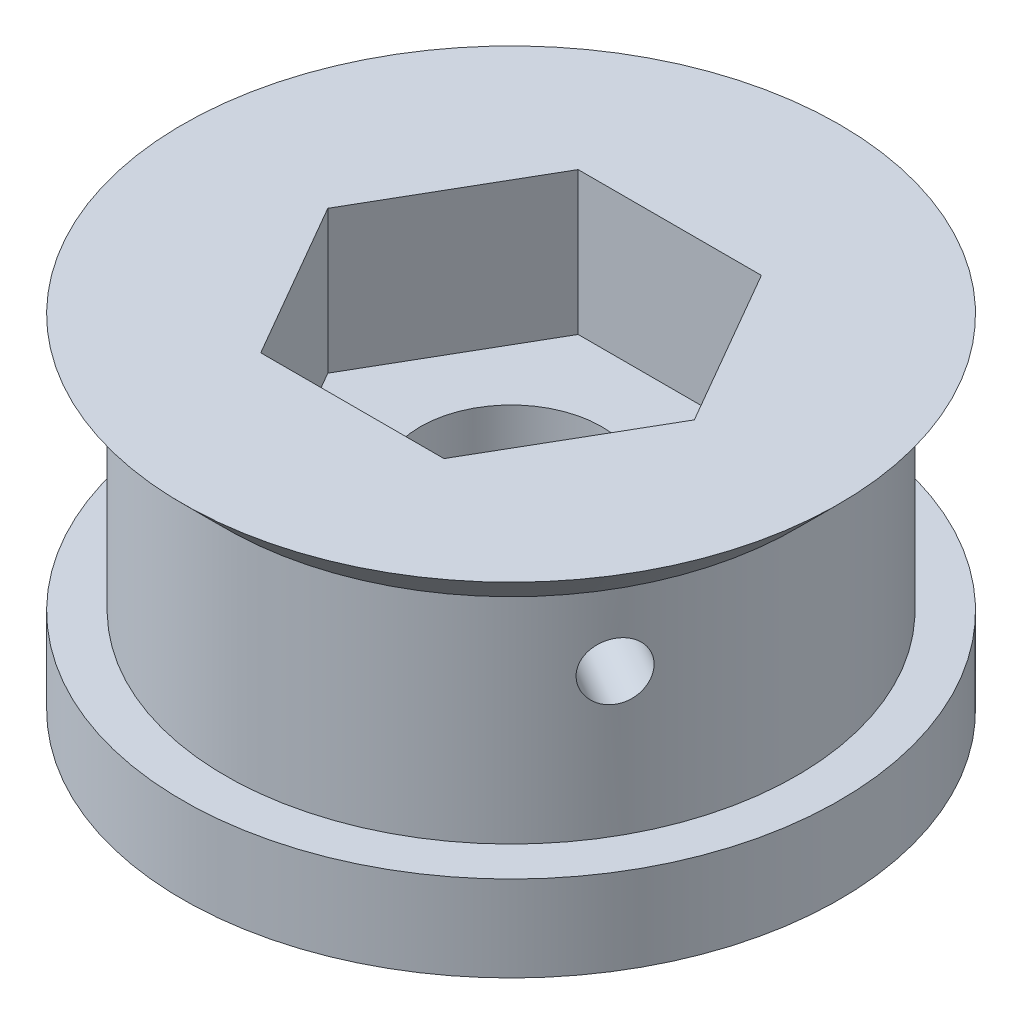
ISO-10303-21;
HEADER;
FILE_DESCRIPTION(('STEP AP214'),'2;1');
FILE_NAME('part.step','',(''),(''),'','','');
FILE_SCHEMA(('AUTOMOTIVE_DESIGN { 1 0 10303 214 1 1 1 1 }'));
ENDSEC;
DATA;
#1=APPLICATION_CONTEXT('core data for automotive mechanical design processes');
#2=APPLICATION_PROTOCOL_DEFINITION('international standard','automotive_design',2000,#1);
#3=PRODUCT_CONTEXT('',#1,'mechanical');
#4=PRODUCT('Part','Part','',(#3));
#5=PRODUCT_RELATED_PRODUCT_CATEGORY('part','',(#4));
#6=PRODUCT_DEFINITION_FORMATION('','',#4);
#7=PRODUCT_DEFINITION_CONTEXT('part definition',#1,'design');
#8=PRODUCT_DEFINITION('design','',#6,#7);
#9=PRODUCT_DEFINITION_SHAPE('','',#8);
#10=(LENGTH_UNIT() NAMED_UNIT(*) SI_UNIT(.MILLI.,.METRE.));
#11=(NAMED_UNIT(*) PLANE_ANGLE_UNIT() SI_UNIT($,.RADIAN.));
#12=(NAMED_UNIT(*) SI_UNIT($,.STERADIAN.) SOLID_ANGLE_UNIT());
#13=UNCERTAINTY_MEASURE_WITH_UNIT(LENGTH_MEASURE(1.E-05),#10,'distance_accuracy_value','');
#14=(GEOMETRIC_REPRESENTATION_CONTEXT(3) GLOBAL_UNCERTAINTY_ASSIGNED_CONTEXT((#13)) GLOBAL_UNIT_ASSIGNED_CONTEXT((#10,
#11,#12)) REPRESENTATION_CONTEXT('',''));
#15=CARTESIAN_POINT('',(0.,0.,0.));
#16=DIRECTION('',(0.,0.,1.));
#17=DIRECTION('',(1.,0.,0.));
#18=AXIS2_PLACEMENT_3D('',#15,#16,#17);
#19=CARTESIAN_POINT('',(0.,0.,0.));
#20=DIRECTION('',(0.,-1.,0.));
#21=DIRECTION('',(0.,0.,-1.));
#22=AXIS2_PLACEMENT_3D('',#19,#20,#21);
#23=CYLINDRICAL_SURFACE('',#22,3.175);
#24=CARTESIAN_POINT('',(0.,0.,0.));
#25=DIRECTION('',(0.,-1.,0.));
#26=DIRECTION('',(0.,0.,-1.));
#27=AXIS2_PLACEMENT_3D('',#24,#25,#26);
#28=CIRCLE('',#27,3.175);
#29=CARTESIAN_POINT('',(0.,0.,-3.175));
#30=VERTEX_POINT('',#29);
#31=EDGE_CURVE('E11',#30,#30,#28,.T.);
#32=ORIENTED_EDGE('',*,*,#31,.T.);
#33=EDGE_LOOP('',(#32));
#34=FACE_BOUND('',#33,.T.);
#35=CARTESIAN_POINT('',(0.,7.,0.));
#36=DIRECTION('',(0.,1.,0.));
#37=DIRECTION('',(0.,0.,1.));
#38=AXIS2_PLACEMENT_3D('',#35,#36,#37);
#39=CIRCLE('',#38,3.175);
#40=CARTESIAN_POINT('',(0.,7.,3.175));
#41=VERTEX_POINT('',#40);
#42=EDGE_CURVE('E36',#41,#41,#39,.T.);
#43=ORIENTED_EDGE('',*,*,#42,.T.);
#44=EDGE_LOOP('',(#43));
#45=FACE_BOUND('',#44,.T.);
#46=ADVANCED_FACE('F32',(#34,#45),#23,.F.);
#47=CARTESIAN_POINT('',(11.5,0.,0.));
#48=DIRECTION('',(0.,-1.,0.));
#49=DIRECTION('',(0.,0.,-1.));
#50=AXIS2_PLACEMENT_3D('',#47,#48,#49);
#51=PLANE('',#50);
#52=CARTESIAN_POINT('',(0.,0.,0.));
#53=DIRECTION('',(0.,-1.,0.));
#54=DIRECTION('',(0.,0.,-1.));
#55=AXIS2_PLACEMENT_3D('',#52,#53,#54);
#56=CIRCLE('',#55,11.5);
#57=CARTESIAN_POINT('',(0.,0.,-11.5));
#58=VERTEX_POINT('',#57);
#59=EDGE_CURVE('E151',#58,#58,#56,.T.);
#60=ORIENTED_EDGE('',*,*,#59,.T.);
#61=EDGE_LOOP('',(#60));
#62=FACE_BOUND('',#61,.T.);
#63=ORIENTED_EDGE('',*,*,#31,.F.);
#64=EDGE_LOOP('',(#63));
#65=FACE_BOUND('',#64,.T.);
#66=ADVANCED_FACE('F34',(#62,#65),#51,.T.);
#67=CARTESIAN_POINT('',(3.175,12.,0.));
#68=DIRECTION('',(0.,1.,0.));
#69=DIRECTION('',(0.,0.,1.));
#70=AXIS2_PLACEMENT_3D('',#67,#68,#69);
#71=PLANE('',#70);
#72=DIRECTION('',(-0.5,0.,-0.866025403784439));
#73=VECTOR('',#72,1.);
#74=CARTESIAN_POINT('',(6.41580486636972,12.,0.));
#75=LINE('',#74,#73);
#76=CARTESIAN_POINT('',(6.41580486636972,12.,0.));
#77=VERTEX_POINT('',#76);
#78=CARTESIAN_POINT('',(3.20790243318486,12.,-5.55625));
#79=VERTEX_POINT('',#78);
#80=EDGE_CURVE('E53',#77,#79,#75,.T.);
#81=ORIENTED_EDGE('',*,*,#80,.F.);
#82=DIRECTION('',(0.5,0.,-0.866025403784438));
#83=VECTOR('',#82,1.);
#84=CARTESIAN_POINT('',(3.20790243318486,12.,5.55625));
#85=LINE('',#84,#83);
#86=CARTESIAN_POINT('',(3.20790243318486,12.,5.55625));
#87=VERTEX_POINT('',#86);
#88=EDGE_CURVE('E110',#87,#77,#85,.T.);
#89=ORIENTED_EDGE('',*,*,#88,.F.);
#90=DIRECTION('',(1.,0.,0.));
#91=VECTOR('',#90,1.);
#92=CARTESIAN_POINT('',(-3.20790243318486,12.,5.55625));
#93=LINE('',#92,#91);
#94=CARTESIAN_POINT('',(-3.20790243318486,12.,5.55625));
#95=VERTEX_POINT('',#94);
#96=EDGE_CURVE('E113',#95,#87,#93,.T.);
#97=ORIENTED_EDGE('',*,*,#96,.F.);
#98=DIRECTION('',(0.5,0.,0.866025403784439));
#99=VECTOR('',#98,1.);
#100=CARTESIAN_POINT('',(-6.41580486636972,12.,0.));
#101=LINE('',#100,#99);
#102=CARTESIAN_POINT('',(-6.41580486636972,12.,0.));
#103=VERTEX_POINT('',#102);
#104=EDGE_CURVE('E137',#103,#95,#101,.T.);
#105=ORIENTED_EDGE('',*,*,#104,.F.);
#106=DIRECTION('',(-0.5,0.,0.866025403784438));
#107=VECTOR('',#106,1.);
#108=CARTESIAN_POINT('',(-3.20790243318486,12.,-5.55625));
#109=LINE('',#108,#107);
#110=CARTESIAN_POINT('',(-3.20790243318486,12.,-5.55625));
#111=VERTEX_POINT('',#110);
#112=EDGE_CURVE('E134',#111,#103,#109,.T.);
#113=ORIENTED_EDGE('',*,*,#112,.F.);
#114=DIRECTION('',(-1.,0.,0.));
#115=VECTOR('',#114,1.);
#116=CARTESIAN_POINT('',(3.20790243318486,12.,-5.55625));
#117=LINE('',#116,#115);
#118=EDGE_CURVE('E132',#79,#111,#117,.T.);
#119=ORIENTED_EDGE('',*,*,#118,.F.);
#120=EDGE_LOOP('',(#81,#89,#97,#105,#113,#119));
#121=FACE_BOUND('',#120,.T.);
#122=CARTESIAN_POINT('',(0.,12.,0.));
#123=DIRECTION('',(0.,-1.,0.));
#124=DIRECTION('',(0.,0.,-1.));
#125=AXIS2_PLACEMENT_3D('',#122,#123,#124);
#126=CIRCLE('',#125,11.5);
#127=CARTESIAN_POINT('',(0.,12.,-11.5));
#128=VERTEX_POINT('',#127);
#129=EDGE_CURVE('E41',#128,#128,#126,.T.);
#130=ORIENTED_EDGE('',*,*,#129,.F.);
#131=EDGE_LOOP('',(#130));
#132=FACE_BOUND('',#131,.T.);
#133=ADVANCED_FACE('F169',(#121,#132),#71,.T.);
#134=CARTESIAN_POINT('',(0.,10.5,0.));
#135=DIRECTION('',(0.,1.,0.));
#136=DIRECTION('',(0.,0.,1.));
#137=AXIS2_PLACEMENT_3D('',#134,#135,#136);
#138=CONICAL_SURFACE('',#137,10.,0.785398163397443);
#139=ORIENTED_EDGE('',*,*,#129,.T.);
#140=EDGE_LOOP('',(#139));
#141=FACE_BOUND('',#140,.T.);
#142=CARTESIAN_POINT('',(0.,10.5,0.));
#143=DIRECTION('',(0.,-1.,0.));
#144=DIRECTION('',(0.,0.,-1.));
#145=AXIS2_PLACEMENT_3D('',#142,#143,#144);
#146=CIRCLE('',#145,10.);
#147=CARTESIAN_POINT('',(0.,10.5,-10.));
#148=VERTEX_POINT('',#147);
#149=EDGE_CURVE('E160',#148,#148,#146,.T.);
#150=ORIENTED_EDGE('',*,*,#149,.F.);
#151=EDGE_LOOP('',(#150));
#152=FACE_BOUND('',#151,.T.);
#153=ADVANCED_FACE('F166',(#141,#152),#138,.T.);
#154=CARTESIAN_POINT('',(0.,0.,0.));
#155=DIRECTION('',(0.,-1.,0.));
#156=DIRECTION('',(0.,0.,-1.));
#157=AXIS2_PLACEMENT_3D('',#154,#155,#156);
#158=CYLINDRICAL_SURFACE('',#157,10.);
#159=CARTESIAN_POINT('',(8.11684396980704,8.,5.84096258931754));
#160=CARTESIAN_POINT('',(8.11684575200482,7.9439804358264,5.84096081626609));
#161=CARTESIAN_POINT('',(8.11961967269046,7.88792383158816,5.8371113286487));
#162=CARTESIAN_POINT('',(8.1306092846913,7.77736481370646,5.82179337358581));
#163=CARTESIAN_POINT('',(8.13883097305262,7.72286418196251,5.81031650968201));
#164=CARTESIAN_POINT('',(8.16037264221174,7.61703418078209,5.78002263594193));
#165=CARTESIAN_POINT('',(8.17368953212485,7.56570291060856,5.76121007600168));
#166=CARTESIAN_POINT('',(8.20488269700397,7.46763220770825,5.71669791008278));
#167=CARTESIAN_POINT('',(8.22275806639933,7.42089186551628,5.69099967193613));
#168=CARTESIAN_POINT('',(8.26243891336855,7.3331487363425,5.63323454180946));
#169=CARTESIAN_POINT('',(8.2842569120863,7.29216499049622,5.60114732541819));
#170=CARTESIAN_POINT('',(8.33096470129663,7.21726239099643,5.53143596600574));
#171=CARTESIAN_POINT('',(8.35585463225464,7.18334386059369,5.49381156977948));
#172=CARTESIAN_POINT('',(8.40786363954371,7.12346874299285,5.41388065631141));
#173=CARTESIAN_POINT('',(8.43498728095796,7.09752900120633,5.3715644860765));
#174=CARTESIAN_POINT('',(8.49048020465015,7.05445556685132,5.28341324240356));
#175=CARTESIAN_POINT('',(8.51884945654662,7.03732165963053,5.23757825477202));
#176=CARTESIAN_POINT('',(8.57580748546881,7.01240209064675,5.14378505065904));
#177=CARTESIAN_POINT('',(8.60439520261445,7.00458516725005,5.09583449752621));
#178=CARTESIAN_POINT('',(8.66101050926589,6.99842473086628,4.99900406503733));
#179=CARTESIAN_POINT('',(8.68903811327571,7.00008097225373,4.9501242098095));
#180=CARTESIAN_POINT('',(8.74364576108523,7.01279447265015,4.85301472463986));
#181=CARTESIAN_POINT('',(8.77023061988573,7.02381811556389,4.80478339529589));
#182=CARTESIAN_POINT('',(8.82138804705192,7.05490112894662,4.71020229452388));
#183=CARTESIAN_POINT('',(8.84596058927355,7.07496061678757,4.66385254754536));
#184=CARTESIAN_POINT('',(8.89258177833299,7.12358276325444,4.57433529914437));
#185=CARTESIAN_POINT('',(8.91462591560279,7.15216029753016,4.53117353102091));
#186=CARTESIAN_POINT('',(8.95570591112574,7.21699652333637,4.44943003467345));
#187=CARTESIAN_POINT('',(8.97474168112141,7.25325544014518,4.41084844082783));
#188=CARTESIAN_POINT('',(9.00955415776648,7.33261422951365,4.33930031456206));
#189=CARTESIAN_POINT('',(9.02531623771613,7.37574334474158,4.30635909335982));
#190=CARTESIAN_POINT('',(9.05323729895348,7.46751686521078,4.24734782379939));
#191=CARTESIAN_POINT('',(9.06539627501467,7.51616127845214,4.22127778540824));
#192=CARTESIAN_POINT('',(9.08594975526988,7.61760702519979,4.17685517913754));
#193=CARTESIAN_POINT('',(9.09434346573781,7.67040923242289,4.15850423851118));
#194=CARTESIAN_POINT('',(9.10725888128564,7.77866060461469,4.13014293734914));
#195=CARTESIAN_POINT('',(9.11178070432917,7.83410968888745,4.12013232271151));
#196=CARTESIAN_POINT('',(9.11688893930952,7.94582417952951,4.10881676070152));
#197=CARTESIAN_POINT('',(9.11749228079468,8.00208502026483,4.10747436299864));
#198=CARTESIAN_POINT('',(9.11480176523561,8.11405126582286,4.11344126878886));
#199=CARTESIAN_POINT('',(9.11150796085038,8.16975667814037,4.12075045538008));
#200=CARTESIAN_POINT('',(9.10107200991016,8.27891158227834,4.14374776394065));
#201=CARTESIAN_POINT('',(9.09393796937796,8.33236557109466,4.15941823618454));
#202=CARTESIAN_POINT('',(9.07591170345611,8.4356400517303,4.19860562538091));
#203=CARTESIAN_POINT('',(9.06501939197951,8.48546046028718,4.22212272206775));
#204=CARTESIAN_POINT('',(9.03957331226275,8.58023997402878,4.27633143153151));
#205=CARTESIAN_POINT('',(9.02500719829536,8.62518194196625,4.30704721017102));
#206=CARTESIAN_POINT('',(8.99244221996695,8.70875505327407,4.3746298433935));
#207=CARTESIAN_POINT('',(8.97444327060867,8.74738604034008,4.41149685027849));
#208=CARTESIAN_POINT('',(8.93523771086365,8.81738163339809,4.49037526406478));
#209=CARTESIAN_POINT('',(8.91401977793291,8.84871955958622,4.53240472605584));
#210=CARTESIAN_POINT('',(8.8688286698156,8.90305586850641,4.62020698238849));
#211=CARTESIAN_POINT('',(8.84485553238734,8.92605436550711,4.6659797254283));
#212=CARTESIAN_POINT('',(8.79472293057572,8.96301376765534,4.75979725403191));
#213=CARTESIAN_POINT('',(8.76856745930125,8.97699078732521,4.80783782300808));
#214=CARTESIAN_POINT('',(8.71467928483357,8.99556306957984,4.90483859927324));
#215=CARTESIAN_POINT('',(8.68694662599017,9.00015859583404,4.95379878067725));
#216=CARTESIAN_POINT('',(8.63078853517729,8.99983373356006,5.05100251395535));
#217=CARTESIAN_POINT('',(8.60236665247362,8.99495476316334,5.09924826011287));
#218=CARTESIAN_POINT('',(8.54555756745848,8.97590625434303,5.19388998570902));
#219=CARTESIAN_POINT('',(8.51717036517425,8.96173670862703,5.2402859636957));
#220=CARTESIAN_POINT('',(8.46133702667971,8.92452074260707,5.3299688461062));
#221=CARTESIAN_POINT('',(8.43389076266835,8.90147553306584,5.37325617363758));
#222=CARTESIAN_POINT('',(8.38085719352687,8.84716683108302,5.45560577815827));
#223=CARTESIAN_POINT('',(8.35526987752058,8.81590338672888,5.49466807986766));
#224=CARTESIAN_POINT('',(8.30675288916956,8.74589038097625,5.56774564341985));
#225=CARTESIAN_POINT('',(8.28383480866454,8.7071099837552,5.60173905909939));
#226=CARTESIAN_POINT('',(8.24162597395887,8.62322464845455,5.66365689151707));
#227=CARTESIAN_POINT('',(8.222336091572,8.57811819483092,5.69157984984553));
#228=CARTESIAN_POINT('',(8.18809241900371,8.48273565808009,5.74073558142804));
#229=CARTESIAN_POINT('',(8.1731497816908,8.43244671867595,5.76195115874718));
#230=CARTESIAN_POINT('',(8.14828213112767,8.32825170875377,5.79706524973052));
#231=CARTESIAN_POINT('',(8.13835145867155,8.27434979607429,5.81097201679578));
#232=CARTESIAN_POINT('',(8.12639102687633,8.18345225910089,5.82767801004129));
#233=CARTESIAN_POINT('',(8.12281754871285,8.14703774869357,5.83265394373114));
#234=CARTESIAN_POINT('',(8.11804343842986,8.07375417695745,5.83929681014159));
#235=CARTESIAN_POINT('',(8.11684279634959,8.03688511753741,5.84096375675274));
#236=CARTESIAN_POINT('',(8.11684396980704,8.,5.84096258931754));
#237=B_SPLINE_CURVE_WITH_KNOTS('',3,(#159,#160,#161,#162,#163,#164,#165,#166,#167,#168,#169,
#170,#171,#172,#173,#174,#175,#176,#177,#178,#179,#180,#181,#182,#183,#184,#185,#186,#187,#188,
#189,#190,#191,#192,#193,#194,#195,#196,#197,#198,#199,#200,#201,#202,#203,#204,#205,#206,#207,
#208,#209,#210,#211,#212,#213,#214,#215,#216,#217,#218,#219,#220,#221,#222,#223,#224,#225,#226,
#227,#228,#229,#230,#231,#232,#233,#234,#235,#236),.UNSPECIFIED.,.T.,.F.,(4,2,2,2,2,2,2,2,2,2,2,
2,2,2,2,2,2,2,2,2,2,2,2,2,2,2,2,2,2,2,2,2,2,2,2,2,2,2,4),(0.,0.167923994436462,0.33603315182177,
0.504040490997476,0.672014480421315,0.840531615299253,1.00905645855253,1.17793469971292,
1.34680882407795,1.5151147089845,1.68341622998233,1.85111631818662,2.01881858480974,
2.18681545466414,2.35481725218529,2.52355425085002,2.69229149427563,2.86106429117934,
3.02983194595033,3.19786996307766,3.36590570966871,3.53358814704528,3.70127442561048,
3.86953189811719,4.03779353723203,4.20666136818119,4.37552688518006,4.54408992694362,
4.7126482311315,4.88047133468484,5.04829456996659,5.21609491995247,5.383894288108,
5.55239715037989,5.72094045034526,5.88991241070477,6.05869314894002,6.16926027606048,
6.27982693903816),.UNSPECIFIED.);
#238=CARTESIAN_POINT('',(8.11684396980704,8.,5.84096258931754));
#239=VERTEX_POINT('',#238);
#240=EDGE_CURVE('E116',#239,#239,#237,.T.);
#241=ORIENTED_EDGE('',*,*,#240,.F.);
#242=EDGE_LOOP('',(#241));
#243=FACE_BOUND('',#242,.T.);
#244=ORIENTED_EDGE('',*,*,#149,.T.);
#245=EDGE_LOOP('',(#244));
#246=FACE_BOUND('',#245,.T.);
#247=CARTESIAN_POINT('',(0.,3.,0.));
#248=DIRECTION('',(0.,-1.,0.));
#249=DIRECTION('',(0.,0.,-1.));
#250=AXIS2_PLACEMENT_3D('',#247,#248,#249);
#251=CIRCLE('',#250,10.);
#252=CARTESIAN_POINT('',(0.,3.,-10.));
#253=VERTEX_POINT('',#252);
#254=EDGE_CURVE('E157',#253,#253,#251,.T.);
#255=ORIENTED_EDGE('',*,*,#254,.F.);
#256=EDGE_LOOP('',(#255));
#257=FACE_BOUND('',#256,.T.);
#258=ADVANCED_FACE('F177',(#243,#246,#257),#158,.T.);
#259=CARTESIAN_POINT('',(10.,3.,0.));
#260=DIRECTION('',(0.,1.,0.));
#261=DIRECTION('',(0.,0.,1.));
#262=AXIS2_PLACEMENT_3D('',#259,#260,#261);
#263=PLANE('',#262);
#264=ORIENTED_EDGE('',*,*,#254,.T.);
#265=EDGE_LOOP('',(#264));
#266=FACE_BOUND('',#265,.T.);
#267=CARTESIAN_POINT('',(0.,3.,0.));
#268=DIRECTION('',(0.,-1.,0.));
#269=DIRECTION('',(0.,0.,-1.));
#270=AXIS2_PLACEMENT_3D('',#267,#268,#269);
#271=CIRCLE('',#270,11.5);
#272=CARTESIAN_POINT('',(0.,3.,-11.5));
#273=VERTEX_POINT('',#272);
#274=EDGE_CURVE('E154',#273,#273,#271,.T.);
#275=ORIENTED_EDGE('',*,*,#274,.F.);
#276=EDGE_LOOP('',(#275));
#277=FACE_BOUND('',#276,.T.);
#278=ADVANCED_FACE('F221',(#266,#277),#263,.T.);
#279=CARTESIAN_POINT('',(0.,0.,0.));
#280=DIRECTION('',(0.,-1.,0.));
#281=DIRECTION('',(0.,0.,-1.));
#282=AXIS2_PLACEMENT_3D('',#279,#280,#281);
#283=CYLINDRICAL_SURFACE('',#282,11.5);
#284=ORIENTED_EDGE('',*,*,#274,.T.);
#285=EDGE_LOOP('',(#284));
#286=FACE_BOUND('',#285,.T.);
#287=ORIENTED_EDGE('',*,*,#59,.F.);
#288=EDGE_LOOP('',(#287));
#289=FACE_BOUND('',#288,.T.);
#290=ADVANCED_FACE('F218',(#286,#289),#283,.T.);
#291=CARTESIAN_POINT('',(6.41580486636972,7.,0.));
#292=DIRECTION('',(0.866025403784439,0.,-0.5));
#293=DIRECTION('',(-0.5,0.,-0.866025403784439));
#294=AXIS2_PLACEMENT_3D('',#291,#292,#293);
#295=PLANE('',#294);
#296=ORIENTED_EDGE('',*,*,#80,.T.);
#297=DIRECTION('',(0.,1.,0.));
#298=VECTOR('',#297,1.);
#299=CARTESIAN_POINT('',(3.20790243318486,7.,-5.55625));
#300=LINE('',#299,#298);
#301=CARTESIAN_POINT('',(3.20790243318486,7.,-5.55625));
#302=VERTEX_POINT('',#301);
#303=EDGE_CURVE('E86',#302,#79,#300,.T.);
#304=ORIENTED_EDGE('',*,*,#303,.F.);
#305=DIRECTION('',(-0.5,0.,-0.866025403784439));
#306=VECTOR('',#305,1.);
#307=CARTESIAN_POINT('',(6.41580486636972,7.,0.));
#308=LINE('',#307,#306);
#309=CARTESIAN_POINT('',(6.41580486636972,7.,0.));
#310=VERTEX_POINT('',#309);
#311=EDGE_CURVE('E90',#310,#302,#308,.T.);
#312=ORIENTED_EDGE('',*,*,#311,.F.);
#313=DIRECTION('',(0.,1.,0.));
#314=VECTOR('',#313,1.);
#315=CARTESIAN_POINT('',(6.41580486636972,7.,0.));
#316=LINE('',#315,#314);
#317=EDGE_CURVE('E142',#310,#77,#316,.T.);
#318=ORIENTED_EDGE('',*,*,#317,.T.);
#319=EDGE_LOOP('',(#296,#304,#312,#318));
#320=FACE_BOUND('',#319,.T.);
#321=ADVANCED_FACE('F88',(#320),#295,.F.);
#322=CARTESIAN_POINT('',(3.20790243318486,7.,5.55625));
#323=DIRECTION('',(0.866025403784438,0.,0.5));
#324=DIRECTION('',(0.5,0.,-0.866025403784438));
#325=AXIS2_PLACEMENT_3D('',#322,#323,#324);
#326=PLANE('',#325);
#327=DIRECTION('',(0.5,0.,-0.866025403784438));
#328=VECTOR('',#327,1.);
#329=CARTESIAN_POINT('',(3.20790243318486,7.,5.55625));
#330=LINE('',#329,#328);
#331=CARTESIAN_POINT('',(4.81185364977729,7.,2.778125));
#332=VERTEX_POINT('',#331);
#333=EDGE_CURVE('E108',#332,#310,#330,.T.);
#334=ORIENTED_EDGE('',*,*,#333,.F.);
#335=CARTESIAN_POINT('',(4.81185364977729,8.,2.778125));
#336=DIRECTION('',(-0.866025403784438,0.,-0.500000000000001));
#337=DIRECTION('',(-0.500000000000001,0.,0.866025403784438));
#338=AXIS2_PLACEMENT_3D('',#335,#336,#337);
#339=CIRCLE('',#338,1.);
#340=EDGE_CURVE('E46',#332,#332,#339,.T.);
#341=ORIENTED_EDGE('',*,*,#340,.F.);
#342=CARTESIAN_POINT('',(3.20790243318486,7.,5.55625));
#343=VERTEX_POINT('',#342);
#344=EDGE_CURVE('E95',#343,#332,#330,.T.);
#345=ORIENTED_EDGE('',*,*,#344,.F.);
#346=DIRECTION('',(0.,1.,0.));
#347=VECTOR('',#346,1.);
#348=CARTESIAN_POINT('',(3.20790243318486,7.,5.55625));
#349=LINE('',#348,#347);
#350=EDGE_CURVE('E144',#343,#87,#349,.T.);
#351=ORIENTED_EDGE('',*,*,#350,.T.);
#352=ORIENTED_EDGE('',*,*,#88,.T.);
#353=ORIENTED_EDGE('',*,*,#317,.F.);
#354=EDGE_LOOP('',(#334,#341,#345,#351,#352,#353));
#355=FACE_BOUND('',#354,.T.);
#356=ADVANCED_FACE('F201',(#355),#326,.F.);
#357=CARTESIAN_POINT('',(-3.20790243318486,7.,5.55625));
#358=DIRECTION('',(0.,0.,1.));
#359=DIRECTION('',(1.,0.,0.));
#360=AXIS2_PLACEMENT_3D('',#357,#358,#359);
#361=PLANE('',#360);
#362=ORIENTED_EDGE('',*,*,#96,.T.);
#363=ORIENTED_EDGE('',*,*,#350,.F.);
#364=DIRECTION('',(1.,0.,0.));
#365=VECTOR('',#364,1.);
#366=CARTESIAN_POINT('',(-3.20790243318486,7.,5.55625));
#367=LINE('',#366,#365);
#368=CARTESIAN_POINT('',(-3.20790243318486,7.,5.55625));
#369=VERTEX_POINT('',#368);
#370=EDGE_CURVE('E127',#369,#343,#367,.T.);
#371=ORIENTED_EDGE('',*,*,#370,.F.);
#372=DIRECTION('',(0.,1.,0.));
#373=VECTOR('',#372,1.);
#374=CARTESIAN_POINT('',(-3.20790243318486,7.,5.55625));
#375=LINE('',#374,#373);
#376=EDGE_CURVE('E146',#369,#95,#375,.T.);
#377=ORIENTED_EDGE('',*,*,#376,.T.);
#378=EDGE_LOOP('',(#362,#363,#371,#377));
#379=FACE_BOUND('',#378,.T.);
#380=ADVANCED_FACE('F204',(#379),#361,.F.);
#381=CARTESIAN_POINT('',(-6.41580486636972,7.,0.));
#382=DIRECTION('',(-0.866025403784439,0.,0.5));
#383=DIRECTION('',(0.5,0.,0.866025403784439));
#384=AXIS2_PLACEMENT_3D('',#381,#382,#383);
#385=PLANE('',#384);
#386=ORIENTED_EDGE('',*,*,#104,.T.);
#387=ORIENTED_EDGE('',*,*,#376,.F.);
#388=DIRECTION('',(0.5,0.,0.866025403784439));
#389=VECTOR('',#388,1.);
#390=CARTESIAN_POINT('',(-6.41580486636972,7.,0.));
#391=LINE('',#390,#389);
#392=CARTESIAN_POINT('',(-6.41580486636972,7.,0.));
#393=VERTEX_POINT('',#392);
#394=EDGE_CURVE('E124',#393,#369,#391,.T.);
#395=ORIENTED_EDGE('',*,*,#394,.F.);
#396=DIRECTION('',(0.,1.,0.));
#397=VECTOR('',#396,1.);
#398=CARTESIAN_POINT('',(-6.41580486636972,7.,0.));
#399=LINE('',#398,#397);
#400=EDGE_CURVE('E148',#393,#103,#399,.T.);
#401=ORIENTED_EDGE('',*,*,#400,.T.);
#402=EDGE_LOOP('',(#386,#387,#395,#401));
#403=FACE_BOUND('',#402,.T.);
#404=ADVANCED_FACE('F208',(#403),#385,.F.);
#405=CARTESIAN_POINT('',(-3.20790243318486,7.,-5.55625));
#406=DIRECTION('',(-0.866025403784439,0.,-0.5));
#407=DIRECTION('',(-0.5,0.,0.866025403784439));
#408=AXIS2_PLACEMENT_3D('',#405,#406,#407);
#409=PLANE('',#408);
#410=ORIENTED_EDGE('',*,*,#112,.T.);
#411=ORIENTED_EDGE('',*,*,#400,.F.);
#412=DIRECTION('',(-0.5,0.,0.866025403784438));
#413=VECTOR('',#412,1.);
#414=CARTESIAN_POINT('',(-3.20790243318486,7.,-5.55625));
#415=LINE('',#414,#413);
#416=CARTESIAN_POINT('',(-3.20790243318486,7.,-5.55625));
#417=VERTEX_POINT('',#416);
#418=EDGE_CURVE('E103',#417,#393,#415,.T.);
#419=ORIENTED_EDGE('',*,*,#418,.F.);
#420=DIRECTION('',(0.,1.,0.));
#421=VECTOR('',#420,1.);
#422=CARTESIAN_POINT('',(-3.20790243318486,7.,-5.55625));
#423=LINE('',#422,#421);
#424=EDGE_CURVE('E94',#417,#111,#423,.T.);
#425=ORIENTED_EDGE('',*,*,#424,.T.);
#426=EDGE_LOOP('',(#410,#411,#419,#425));
#427=FACE_BOUND('',#426,.T.);
#428=ADVANCED_FACE('F197',(#427),#409,.F.);
#429=CARTESIAN_POINT('',(3.20790243318486,7.,-5.55625));
#430=DIRECTION('',(0.,0.,-1.));
#431=DIRECTION('',(-1.,0.,0.));
#432=AXIS2_PLACEMENT_3D('',#429,#430,#431);
#433=PLANE('',#432);
#434=ORIENTED_EDGE('',*,*,#118,.T.);
#435=ORIENTED_EDGE('',*,*,#424,.F.);
#436=DIRECTION('',(-1.,0.,0.));
#437=VECTOR('',#436,1.);
#438=CARTESIAN_POINT('',(3.20790243318486,7.,-5.55625));
#439=LINE('',#438,#437);
#440=EDGE_CURVE('E98',#302,#417,#439,.T.);
#441=ORIENTED_EDGE('',*,*,#440,.F.);
#442=ORIENTED_EDGE('',*,*,#303,.T.);
#443=EDGE_LOOP('',(#434,#435,#441,#442));
#444=FACE_BOUND('',#443,.T.);
#445=ADVANCED_FACE('F99',(#444),#433,.F.);
#446=CARTESIAN_POINT('',(0.,7.,0.));
#447=DIRECTION('',(0.,1.,0.));
#448=DIRECTION('',(0.,0.,1.));
#449=AXIS2_PLACEMENT_3D('',#446,#447,#448);
#450=PLANE('',#449);
#451=ORIENTED_EDGE('',*,*,#42,.F.);
#452=EDGE_LOOP('',(#451));
#453=FACE_BOUND('',#452,.T.);
#454=ORIENTED_EDGE('',*,*,#311,.T.);
#455=ORIENTED_EDGE('',*,*,#440,.T.);
#456=ORIENTED_EDGE('',*,*,#418,.T.);
#457=ORIENTED_EDGE('',*,*,#394,.T.);
#458=ORIENTED_EDGE('',*,*,#370,.T.);
#459=ORIENTED_EDGE('',*,*,#344,.T.);
#460=ORIENTED_EDGE('',*,*,#333,.T.);
#461=EDGE_LOOP('',(#454,#455,#456,#457,#458,#459,#460));
#462=FACE_BOUND('',#461,.T.);
#463=ADVANCED_FACE('F105',(#453,#462),#450,.T.);
#464=CARTESIAN_POINT('',(13.6046460717605,8.,7.85464607176053));
#465=DIRECTION('',(-0.866025403784438,0.,-0.500000000000001));
#466=DIRECTION('',(-0.500000000000001,0.,0.866025403784438));
#467=AXIS2_PLACEMENT_3D('',#464,#465,#466);
#468=CYLINDRICAL_SURFACE('',#467,1.);
#469=ORIENTED_EDGE('',*,*,#240,.T.);
#470=EDGE_LOOP('',(#469));
#471=FACE_BOUND('',#470,.T.);
#472=ORIENTED_EDGE('',*,*,#340,.T.);
#473=EDGE_LOOP('',(#472));
#474=FACE_BOUND('',#473,.T.);
#475=ADVANCED_FACE('F190',(#471,#474),#468,.F.);
#476=CLOSED_SHELL('',(#46,#66,#133,#153,#258,#278,#290,#321,#356,#380,#404,#428,#445,#463,#475));
#477=MANIFOLD_SOLID_BREP('B2',#476);
#478=ADVANCED_BREP_SHAPE_REPRESENTATION('',(#18,#477),#14);
#479=SHAPE_DEFINITION_REPRESENTATION(#9,#478);
ENDSEC;
END-ISO-10303-21;
